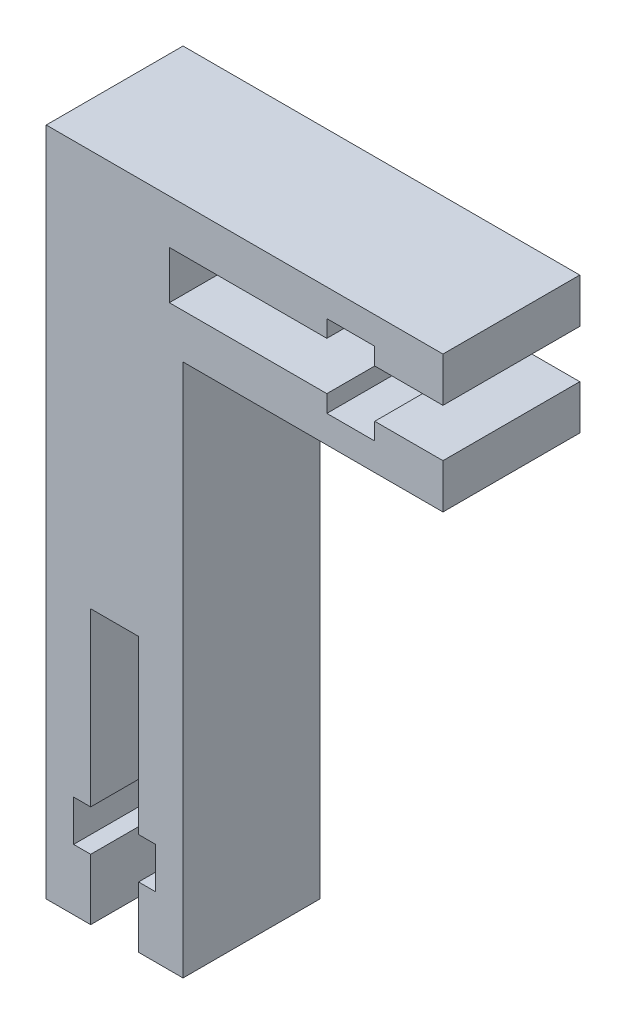
ISO-10303-21;
HEADER;
FILE_DESCRIPTION(('STEP AP214'),'2;1');
FILE_NAME('part.step','',(''),(''),'','','');
FILE_SCHEMA(('AUTOMOTIVE_DESIGN { 1 0 10303 214 1 1 1 1 }'));
ENDSEC;
DATA;
#1=APPLICATION_CONTEXT('core data for automotive mechanical design processes');
#2=APPLICATION_PROTOCOL_DEFINITION('international standard','automotive_design',2000,#1);
#3=PRODUCT_CONTEXT('',#1,'mechanical');
#4=PRODUCT('Part','Part','',(#3));
#5=PRODUCT_RELATED_PRODUCT_CATEGORY('part','',(#4));
#6=PRODUCT_DEFINITION_FORMATION('','',#4);
#7=PRODUCT_DEFINITION_CONTEXT('part definition',#1,'design');
#8=PRODUCT_DEFINITION('design','',#6,#7);
#9=PRODUCT_DEFINITION_SHAPE('','',#8);
#10=(LENGTH_UNIT() NAMED_UNIT(*) SI_UNIT(.MILLI.,.METRE.));
#11=(NAMED_UNIT(*) PLANE_ANGLE_UNIT() SI_UNIT($,.RADIAN.));
#12=(NAMED_UNIT(*) SI_UNIT($,.STERADIAN.) SOLID_ANGLE_UNIT());
#13=UNCERTAINTY_MEASURE_WITH_UNIT(LENGTH_MEASURE(1.E-05),#10,'distance_accuracy_value','');
#14=(GEOMETRIC_REPRESENTATION_CONTEXT(3) GLOBAL_UNCERTAINTY_ASSIGNED_CONTEXT((#13)) GLOBAL_UNIT_ASSIGNED_CONTEXT((#10,
#11,#12)) REPRESENTATION_CONTEXT('',''));
#15=CARTESIAN_POINT('',(0.,0.,0.));
#16=DIRECTION('',(0.,0.,1.));
#17=DIRECTION('',(1.,0.,0.));
#18=AXIS2_PLACEMENT_3D('',#15,#16,#17);
#19=CARTESIAN_POINT('',(0.,49.,10.));
#20=DIRECTION('',(1.,0.,0.));
#21=DIRECTION('',(0.,0.,-1.));
#22=AXIS2_PLACEMENT_3D('',#19,#20,#21);
#23=PLANE('',#22);
#24=DIRECTION('',(0.,-1.,0.));
#25=VECTOR('',#24,1.);
#26=CARTESIAN_POINT('',(0.,49.,0.));
#27=LINE('',#26,#25);
#28=CARTESIAN_POINT('',(0.,49.,0.));
#29=VERTEX_POINT('',#28);
#30=CARTESIAN_POINT('',(0.,0.,0.));
#31=VERTEX_POINT('',#30);
#32=EDGE_CURVE('E261',#29,#31,#27,.T.);
#33=ORIENTED_EDGE('',*,*,#32,.T.);
#34=DIRECTION('',(0.,0.,-1.));
#35=VECTOR('',#34,1.);
#36=CARTESIAN_POINT('',(0.,0.,10.));
#37=LINE('',#36,#35);
#38=CARTESIAN_POINT('',(0.,0.,10.));
#39=VERTEX_POINT('',#38);
#40=EDGE_CURVE('E11',#39,#31,#37,.T.);
#41=ORIENTED_EDGE('',*,*,#40,.F.);
#42=DIRECTION('',(0.,-1.,0.));
#43=VECTOR('',#42,1.);
#44=CARTESIAN_POINT('',(0.,49.,10.));
#45=LINE('',#44,#43);
#46=CARTESIAN_POINT('',(0.,49.,10.));
#47=VERTEX_POINT('',#46);
#48=EDGE_CURVE('E319',#47,#39,#45,.T.);
#49=ORIENTED_EDGE('',*,*,#48,.F.);
#50=DIRECTION('',(0.,0.,-1.));
#51=VECTOR('',#50,1.);
#52=CARTESIAN_POINT('',(0.,49.,10.));
#53=LINE('',#52,#51);
#54=EDGE_CURVE('E257',#47,#29,#53,.T.);
#55=ORIENTED_EDGE('',*,*,#54,.T.);
#56=EDGE_LOOP('',(#33,#41,#49,#55));
#57=FACE_BOUND('',#56,.T.);
#58=ADVANCED_FACE('F33',(#57),#23,.F.);
#59=CARTESIAN_POINT('',(0.,0.,10.));
#60=DIRECTION('',(0.,1.,0.));
#61=DIRECTION('',(0.,0.,1.));
#62=AXIS2_PLACEMENT_3D('',#59,#60,#61);
#63=PLANE('',#62);
#64=DIRECTION('',(1.,0.,0.));
#65=VECTOR('',#64,1.);
#66=CARTESIAN_POINT('',(0.,0.,0.));
#67=LINE('',#66,#65);
#68=CARTESIAN_POINT('',(3.25,0.,0.));
#69=VERTEX_POINT('',#68);
#70=EDGE_CURVE('E264',#31,#69,#67,.T.);
#71=ORIENTED_EDGE('',*,*,#70,.T.);
#72=DIRECTION('',(0.,0.,-1.));
#73=VECTOR('',#72,1.);
#74=CARTESIAN_POINT('',(3.25,0.,10.));
#75=LINE('',#74,#73);
#76=CARTESIAN_POINT('',(3.25,0.,10.));
#77=VERTEX_POINT('',#76);
#78=EDGE_CURVE('E41',#77,#69,#75,.T.);
#79=ORIENTED_EDGE('',*,*,#78,.F.);
#80=DIRECTION('',(1.,0.,0.));
#81=VECTOR('',#80,1.);
#82=CARTESIAN_POINT('',(0.,0.,10.));
#83=LINE('',#82,#81);
#84=EDGE_CURVE('E158',#39,#77,#83,.T.);
#85=ORIENTED_EDGE('',*,*,#84,.F.);
#86=ORIENTED_EDGE('',*,*,#40,.T.);
#87=EDGE_LOOP('',(#71,#79,#85,#86));
#88=FACE_BOUND('',#87,.T.);
#89=ADVANCED_FACE('F487',(#88),#63,.F.);
#90=CARTESIAN_POINT('',(3.25,0.,10.));
#91=DIRECTION('',(-1.,0.,0.));
#92=DIRECTION('',(0.,0.,1.));
#93=AXIS2_PLACEMENT_3D('',#90,#91,#92);
#94=PLANE('',#93);
#95=DIRECTION('',(0.,1.,0.));
#96=VECTOR('',#95,1.);
#97=CARTESIAN_POINT('',(3.25,0.,0.));
#98=LINE('',#97,#96);
#99=CARTESIAN_POINT('',(3.25,4.45640920719067,0.));
#100=VERTEX_POINT('',#99);
#101=EDGE_CURVE('E266',#69,#100,#98,.T.);
#102=ORIENTED_EDGE('',*,*,#101,.T.);
#103=DIRECTION('',(0.,0.,-1.));
#104=VECTOR('',#103,1.);
#105=CARTESIAN_POINT('',(3.25,4.45640920719067,10.));
#106=LINE('',#105,#104);
#107=CARTESIAN_POINT('',(3.25,4.45640920719067,10.));
#108=VERTEX_POINT('',#107);
#109=EDGE_CURVE('E392',#108,#100,#106,.T.);
#110=ORIENTED_EDGE('',*,*,#109,.F.);
#111=DIRECTION('',(0.,1.,0.));
#112=VECTOR('',#111,1.);
#113=CARTESIAN_POINT('',(3.25,0.,10.));
#114=LINE('',#113,#112);
#115=EDGE_CURVE('E400',#77,#108,#114,.T.);
#116=ORIENTED_EDGE('',*,*,#115,.F.);
#117=ORIENTED_EDGE('',*,*,#78,.T.);
#118=EDGE_LOOP('',(#102,#110,#116,#117));
#119=FACE_BOUND('',#118,.T.);
#120=ADVANCED_FACE('F398',(#119),#94,.F.);
#121=CARTESIAN_POINT('',(3.25,4.45640920719067,10.));
#122=DIRECTION('',(0.,-1.,0.));
#123=DIRECTION('',(0.,0.,-1.));
#124=AXIS2_PLACEMENT_3D('',#121,#122,#123);
#125=PLANE('',#124);
#126=DIRECTION('',(-1.,0.,0.));
#127=VECTOR('',#126,1.);
#128=CARTESIAN_POINT('',(3.25,4.45640920719067,0.));
#129=LINE('',#128,#127);
#130=CARTESIAN_POINT('',(2.,4.45640920719067,0.));
#131=VERTEX_POINT('',#130);
#132=EDGE_CURVE('E268',#100,#131,#129,.T.);
#133=ORIENTED_EDGE('',*,*,#132,.T.);
#134=DIRECTION('',(0.,0.,-1.));
#135=VECTOR('',#134,1.);
#136=CARTESIAN_POINT('',(2.,4.45640920719067,10.));
#137=LINE('',#136,#135);
#138=CARTESIAN_POINT('',(2.,4.45640920719067,10.));
#139=VERTEX_POINT('',#138);
#140=EDGE_CURVE('E389',#139,#131,#137,.T.);
#141=ORIENTED_EDGE('',*,*,#140,.F.);
#142=DIRECTION('',(-1.,0.,0.));
#143=VECTOR('',#142,1.);
#144=CARTESIAN_POINT('',(3.25,4.45640920719067,10.));
#145=LINE('',#144,#143);
#146=EDGE_CURVE('E418',#108,#139,#145,.T.);
#147=ORIENTED_EDGE('',*,*,#146,.F.);
#148=ORIENTED_EDGE('',*,*,#109,.T.);
#149=EDGE_LOOP('',(#133,#141,#147,#148));
#150=FACE_BOUND('',#149,.T.);
#151=ADVANCED_FACE('F409',(#150),#125,.F.);
#152=CARTESIAN_POINT('',(2.,4.45640920719067,10.));
#153=DIRECTION('',(-1.,0.,0.));
#154=DIRECTION('',(0.,0.,1.));
#155=AXIS2_PLACEMENT_3D('',#152,#153,#154);
#156=PLANE('',#155);
#157=DIRECTION('',(0.,1.,0.));
#158=VECTOR('',#157,1.);
#159=CARTESIAN_POINT('',(2.,4.45640920719067,0.));
#160=LINE('',#159,#158);
#161=CARTESIAN_POINT('',(2.,7.45640920719067,0.));
#162=VERTEX_POINT('',#161);
#163=EDGE_CURVE('E270',#131,#162,#160,.T.);
#164=ORIENTED_EDGE('',*,*,#163,.T.);
#165=DIRECTION('',(0.,0.,-1.));
#166=VECTOR('',#165,1.);
#167=CARTESIAN_POINT('',(2.,7.45640920719067,10.));
#168=LINE('',#167,#166);
#169=CARTESIAN_POINT('',(2.,7.45640920719067,10.));
#170=VERTEX_POINT('',#169);
#171=EDGE_CURVE('E386',#170,#162,#168,.T.);
#172=ORIENTED_EDGE('',*,*,#171,.F.);
#173=DIRECTION('',(0.,1.,0.));
#174=VECTOR('',#173,1.);
#175=CARTESIAN_POINT('',(2.,4.45640920719067,10.));
#176=LINE('',#175,#174);
#177=EDGE_CURVE('E415',#139,#170,#176,.T.);
#178=ORIENTED_EDGE('',*,*,#177,.F.);
#179=ORIENTED_EDGE('',*,*,#140,.T.);
#180=EDGE_LOOP('',(#164,#172,#178,#179));
#181=FACE_BOUND('',#180,.T.);
#182=ADVANCED_FACE('F413',(#181),#156,.F.);
#183=CARTESIAN_POINT('',(2.,7.45640920719067,10.));
#184=DIRECTION('',(0.,1.,0.));
#185=DIRECTION('',(0.,0.,1.));
#186=AXIS2_PLACEMENT_3D('',#183,#184,#185);
#187=PLANE('',#186);
#188=DIRECTION('',(1.,0.,0.));
#189=VECTOR('',#188,1.);
#190=CARTESIAN_POINT('',(2.,7.45640920719067,0.));
#191=LINE('',#190,#189);
#192=CARTESIAN_POINT('',(3.25,7.45640920719067,0.));
#193=VERTEX_POINT('',#192);
#194=EDGE_CURVE('E272',#162,#193,#191,.T.);
#195=ORIENTED_EDGE('',*,*,#194,.T.);
#196=DIRECTION('',(0.,0.,-1.));
#197=VECTOR('',#196,1.);
#198=CARTESIAN_POINT('',(3.25,7.45640920719067,10.));
#199=LINE('',#198,#197);
#200=CARTESIAN_POINT('',(3.25,7.45640920719067,10.));
#201=VERTEX_POINT('',#200);
#202=EDGE_CURVE('E383',#201,#193,#199,.T.);
#203=ORIENTED_EDGE('',*,*,#202,.F.);
#204=DIRECTION('',(1.,0.,0.));
#205=VECTOR('',#204,1.);
#206=CARTESIAN_POINT('',(2.,7.45640920719067,10.));
#207=LINE('',#206,#205);
#208=EDGE_CURVE('E417',#170,#201,#207,.T.);
#209=ORIENTED_EDGE('',*,*,#208,.F.);
#210=ORIENTED_EDGE('',*,*,#171,.T.);
#211=EDGE_LOOP('',(#195,#203,#209,#210));
#212=FACE_BOUND('',#211,.T.);
#213=ADVANCED_FACE('F500',(#212),#187,.F.);
#214=CARTESIAN_POINT('',(3.25,7.45640920719067,10.));
#215=DIRECTION('',(-1.,0.,0.));
#216=DIRECTION('',(0.,0.,1.));
#217=AXIS2_PLACEMENT_3D('',#214,#215,#216);
#218=PLANE('',#217);
#219=DIRECTION('',(0.,1.,0.));
#220=VECTOR('',#219,1.);
#221=CARTESIAN_POINT('',(3.25,7.45640920719067,0.));
#222=LINE('',#221,#220);
#223=CARTESIAN_POINT('',(3.25,20.,0.));
#224=VERTEX_POINT('',#223);
#225=EDGE_CURVE('E274',#193,#224,#222,.T.);
#226=ORIENTED_EDGE('',*,*,#225,.T.);
#227=DIRECTION('',(0.,0.,-1.));
#228=VECTOR('',#227,1.);
#229=CARTESIAN_POINT('',(3.25,20.,10.));
#230=LINE('',#229,#228);
#231=CARTESIAN_POINT('',(3.25,20.,10.));
#232=VERTEX_POINT('',#231);
#233=EDGE_CURVE('E380',#232,#224,#230,.T.);
#234=ORIENTED_EDGE('',*,*,#233,.F.);
#235=DIRECTION('',(0.,1.,0.));
#236=VECTOR('',#235,1.);
#237=CARTESIAN_POINT('',(3.25,7.45640920719067,10.));
#238=LINE('',#237,#236);
#239=EDGE_CURVE('E420',#201,#232,#238,.T.);
#240=ORIENTED_EDGE('',*,*,#239,.F.);
#241=ORIENTED_EDGE('',*,*,#202,.T.);
#242=EDGE_LOOP('',(#226,#234,#240,#241));
#243=FACE_BOUND('',#242,.T.);
#244=ADVANCED_FACE('F503',(#243),#218,.F.);
#245=CARTESIAN_POINT('',(3.25,20.,10.));
#246=DIRECTION('',(0.,1.,0.));
#247=DIRECTION('',(0.,0.,1.));
#248=AXIS2_PLACEMENT_3D('',#245,#246,#247);
#249=PLANE('',#248);
#250=DIRECTION('',(1.,0.,0.));
#251=VECTOR('',#250,1.);
#252=CARTESIAN_POINT('',(3.25,20.,0.));
#253=LINE('',#252,#251);
#254=CARTESIAN_POINT('',(6.75,20.,0.));
#255=VERTEX_POINT('',#254);
#256=EDGE_CURVE('E276',#224,#255,#253,.T.);
#257=ORIENTED_EDGE('',*,*,#256,.T.);
#258=DIRECTION('',(0.,0.,-1.));
#259=VECTOR('',#258,1.);
#260=CARTESIAN_POINT('',(6.75,20.,10.));
#261=LINE('',#260,#259);
#262=CARTESIAN_POINT('',(6.75,20.,10.));
#263=VERTEX_POINT('',#262);
#264=EDGE_CURVE('E377',#263,#255,#261,.T.);
#265=ORIENTED_EDGE('',*,*,#264,.F.);
#266=DIRECTION('',(1.,0.,0.));
#267=VECTOR('',#266,1.);
#268=CARTESIAN_POINT('',(3.25,20.,10.));
#269=LINE('',#268,#267);
#270=EDGE_CURVE('E426',#232,#263,#269,.T.);
#271=ORIENTED_EDGE('',*,*,#270,.F.);
#272=ORIENTED_EDGE('',*,*,#233,.T.);
#273=EDGE_LOOP('',(#257,#265,#271,#272));
#274=FACE_BOUND('',#273,.T.);
#275=ADVANCED_FACE('F507',(#274),#249,.F.);
#276=CARTESIAN_POINT('',(6.75,20.,10.));
#277=DIRECTION('',(1.,0.,0.));
#278=DIRECTION('',(0.,0.,-1.));
#279=AXIS2_PLACEMENT_3D('',#276,#277,#278);
#280=PLANE('',#279);
#281=DIRECTION('',(0.,-1.,0.));
#282=VECTOR('',#281,1.);
#283=CARTESIAN_POINT('',(6.75,20.,0.));
#284=LINE('',#283,#282);
#285=CARTESIAN_POINT('',(6.75,7.45640920719067,0.));
#286=VERTEX_POINT('',#285);
#287=EDGE_CURVE('E278',#255,#286,#284,.T.);
#288=ORIENTED_EDGE('',*,*,#287,.T.);
#289=DIRECTION('',(0.,0.,-1.));
#290=VECTOR('',#289,1.);
#291=CARTESIAN_POINT('',(6.75,7.45640920719067,10.));
#292=LINE('',#291,#290);
#293=CARTESIAN_POINT('',(6.75,7.45640920719067,10.));
#294=VERTEX_POINT('',#293);
#295=EDGE_CURVE('E374',#294,#286,#292,.T.);
#296=ORIENTED_EDGE('',*,*,#295,.F.);
#297=DIRECTION('',(0.,-1.,0.));
#298=VECTOR('',#297,1.);
#299=CARTESIAN_POINT('',(6.75,20.,10.));
#300=LINE('',#299,#298);
#301=EDGE_CURVE('E428',#263,#294,#300,.T.);
#302=ORIENTED_EDGE('',*,*,#301,.F.);
#303=ORIENTED_EDGE('',*,*,#264,.T.);
#304=EDGE_LOOP('',(#288,#296,#302,#303));
#305=FACE_BOUND('',#304,.T.);
#306=ADVANCED_FACE('F511',(#305),#280,.F.);
#307=CARTESIAN_POINT('',(6.75,7.45640920719067,10.));
#308=DIRECTION('',(0.,1.,0.));
#309=DIRECTION('',(0.,0.,1.));
#310=AXIS2_PLACEMENT_3D('',#307,#308,#309);
#311=PLANE('',#310);
#312=DIRECTION('',(1.,0.,0.));
#313=VECTOR('',#312,1.);
#314=CARTESIAN_POINT('',(6.75,7.45640920719067,0.));
#315=LINE('',#314,#313);
#316=CARTESIAN_POINT('',(8.,7.45640920719067,0.));
#317=VERTEX_POINT('',#316);
#318=EDGE_CURVE('E280',#286,#317,#315,.T.);
#319=ORIENTED_EDGE('',*,*,#318,.T.);
#320=DIRECTION('',(0.,0.,-1.));
#321=VECTOR('',#320,1.);
#322=CARTESIAN_POINT('',(8.,7.45640920719067,10.));
#323=LINE('',#322,#321);
#324=CARTESIAN_POINT('',(8.,7.45640920719067,10.));
#325=VERTEX_POINT('',#324);
#326=EDGE_CURVE('E371',#325,#317,#323,.T.);
#327=ORIENTED_EDGE('',*,*,#326,.F.);
#328=DIRECTION('',(1.,0.,0.));
#329=VECTOR('',#328,1.);
#330=CARTESIAN_POINT('',(6.75,7.45640920719067,10.));
#331=LINE('',#330,#329);
#332=EDGE_CURVE('E430',#294,#325,#331,.T.);
#333=ORIENTED_EDGE('',*,*,#332,.F.);
#334=ORIENTED_EDGE('',*,*,#295,.T.);
#335=EDGE_LOOP('',(#319,#327,#333,#334));
#336=FACE_BOUND('',#335,.T.);
#337=ADVANCED_FACE('F515',(#336),#311,.F.);
#338=CARTESIAN_POINT('',(8.,7.45640920719067,10.));
#339=DIRECTION('',(1.,0.,0.));
#340=DIRECTION('',(0.,0.,-1.));
#341=AXIS2_PLACEMENT_3D('',#338,#339,#340);
#342=PLANE('',#341);
#343=DIRECTION('',(0.,-1.,0.));
#344=VECTOR('',#343,1.);
#345=CARTESIAN_POINT('',(8.,7.45640920719067,0.));
#346=LINE('',#345,#344);
#347=CARTESIAN_POINT('',(8.,4.45640920719067,0.));
#348=VERTEX_POINT('',#347);
#349=EDGE_CURVE('E282',#317,#348,#346,.T.);
#350=ORIENTED_EDGE('',*,*,#349,.T.);
#351=DIRECTION('',(0.,0.,-1.));
#352=VECTOR('',#351,1.);
#353=CARTESIAN_POINT('',(8.,4.45640920719067,10.));
#354=LINE('',#353,#352);
#355=CARTESIAN_POINT('',(8.,4.45640920719067,10.));
#356=VERTEX_POINT('',#355);
#357=EDGE_CURVE('E368',#356,#348,#354,.T.);
#358=ORIENTED_EDGE('',*,*,#357,.F.);
#359=DIRECTION('',(0.,-1.,0.));
#360=VECTOR('',#359,1.);
#361=CARTESIAN_POINT('',(8.,7.45640920719067,10.));
#362=LINE('',#361,#360);
#363=EDGE_CURVE('E432',#325,#356,#362,.T.);
#364=ORIENTED_EDGE('',*,*,#363,.F.);
#365=ORIENTED_EDGE('',*,*,#326,.T.);
#366=EDGE_LOOP('',(#350,#358,#364,#365));
#367=FACE_BOUND('',#366,.T.);
#368=ADVANCED_FACE('F519',(#367),#342,.F.);
#369=CARTESIAN_POINT('',(8.,4.45640920719067,10.));
#370=DIRECTION('',(0.,-1.,0.));
#371=DIRECTION('',(0.,0.,-1.));
#372=AXIS2_PLACEMENT_3D('',#369,#370,#371);
#373=PLANE('',#372);
#374=DIRECTION('',(-1.,0.,0.));
#375=VECTOR('',#374,1.);
#376=CARTESIAN_POINT('',(8.,4.45640920719067,0.));
#377=LINE('',#376,#375);
#378=CARTESIAN_POINT('',(6.75,4.45640920719067,0.));
#379=VERTEX_POINT('',#378);
#380=EDGE_CURVE('E284',#348,#379,#377,.T.);
#381=ORIENTED_EDGE('',*,*,#380,.T.);
#382=DIRECTION('',(0.,0.,-1.));
#383=VECTOR('',#382,1.);
#384=CARTESIAN_POINT('',(6.75,4.45640920719067,10.));
#385=LINE('',#384,#383);
#386=CARTESIAN_POINT('',(6.75,4.45640920719067,10.));
#387=VERTEX_POINT('',#386);
#388=EDGE_CURVE('E365',#387,#379,#385,.T.);
#389=ORIENTED_EDGE('',*,*,#388,.F.);
#390=DIRECTION('',(-1.,0.,0.));
#391=VECTOR('',#390,1.);
#392=CARTESIAN_POINT('',(8.,4.45640920719067,10.));
#393=LINE('',#392,#391);
#394=EDGE_CURVE('E434',#356,#387,#393,.T.);
#395=ORIENTED_EDGE('',*,*,#394,.F.);
#396=ORIENTED_EDGE('',*,*,#357,.T.);
#397=EDGE_LOOP('',(#381,#389,#395,#396));
#398=FACE_BOUND('',#397,.T.);
#399=ADVANCED_FACE('F523',(#398),#373,.F.);
#400=CARTESIAN_POINT('',(6.75,4.45640920719067,10.));
#401=DIRECTION('',(1.,0.,0.));
#402=DIRECTION('',(0.,1.,0.));
#403=AXIS2_PLACEMENT_3D('',#400,#401,#402);
#404=PLANE('',#403);
#405=DIRECTION('',(0.,-1.,0.));
#406=VECTOR('',#405,1.);
#407=CARTESIAN_POINT('',(6.75,4.45640920719067,0.));
#408=LINE('',#407,#406);
#409=CARTESIAN_POINT('',(6.75,0.,0.));
#410=VERTEX_POINT('',#409);
#411=EDGE_CURVE('E286',#379,#410,#408,.T.);
#412=ORIENTED_EDGE('',*,*,#411,.T.);
#413=DIRECTION('',(0.,0.,-1.));
#414=VECTOR('',#413,1.);
#415=CARTESIAN_POINT('',(6.75,0.,10.));
#416=LINE('',#415,#414);
#417=CARTESIAN_POINT('',(6.75,0.,10.));
#418=VERTEX_POINT('',#417);
#419=EDGE_CURVE('E362',#418,#410,#416,.T.);
#420=ORIENTED_EDGE('',*,*,#419,.F.);
#421=DIRECTION('',(0.,-1.,0.));
#422=VECTOR('',#421,1.);
#423=CARTESIAN_POINT('',(6.75,4.45640920719067,10.));
#424=LINE('',#423,#422);
#425=EDGE_CURVE('E436',#387,#418,#424,.T.);
#426=ORIENTED_EDGE('',*,*,#425,.F.);
#427=ORIENTED_EDGE('',*,*,#388,.T.);
#428=EDGE_LOOP('',(#412,#420,#426,#427));
#429=FACE_BOUND('',#428,.T.);
#430=ADVANCED_FACE('F527',(#429),#404,.F.);
#431=CARTESIAN_POINT('',(6.75,0.,10.));
#432=DIRECTION('',(0.,1.,0.));
#433=DIRECTION('',(0.,0.,1.));
#434=AXIS2_PLACEMENT_3D('',#431,#432,#433);
#435=PLANE('',#434);
#436=DIRECTION('',(1.,0.,0.));
#437=VECTOR('',#436,1.);
#438=CARTESIAN_POINT('',(6.75,0.,0.));
#439=LINE('',#438,#437);
#440=CARTESIAN_POINT('',(10.,0.,0.));
#441=VERTEX_POINT('',#440);
#442=EDGE_CURVE('E288',#410,#441,#439,.T.);
#443=ORIENTED_EDGE('',*,*,#442,.T.);
#444=DIRECTION('',(0.,0.,-1.));
#445=VECTOR('',#444,1.);
#446=CARTESIAN_POINT('',(10.,0.,10.));
#447=LINE('',#446,#445);
#448=CARTESIAN_POINT('',(10.,0.,10.));
#449=VERTEX_POINT('',#448);
#450=EDGE_CURVE('E359',#449,#441,#447,.T.);
#451=ORIENTED_EDGE('',*,*,#450,.F.);
#452=DIRECTION('',(1.,0.,0.));
#453=VECTOR('',#452,1.);
#454=CARTESIAN_POINT('',(6.75,0.,10.));
#455=LINE('',#454,#453);
#456=EDGE_CURVE('E438',#418,#449,#455,.T.);
#457=ORIENTED_EDGE('',*,*,#456,.F.);
#458=ORIENTED_EDGE('',*,*,#419,.T.);
#459=EDGE_LOOP('',(#443,#451,#457,#458));
#460=FACE_BOUND('',#459,.T.);
#461=ADVANCED_FACE('F531',(#460),#435,.F.);
#462=CARTESIAN_POINT('',(10.,0.,10.));
#463=DIRECTION('',(-1.,0.,0.));
#464=DIRECTION('',(0.,0.,1.));
#465=AXIS2_PLACEMENT_3D('',#462,#463,#464);
#466=PLANE('',#465);
#467=DIRECTION('',(0.,1.,0.));
#468=VECTOR('',#467,1.);
#469=CARTESIAN_POINT('',(10.,0.,0.));
#470=LINE('',#469,#468);
#471=CARTESIAN_POINT('',(10.,39.,0.));
#472=VERTEX_POINT('',#471);
#473=EDGE_CURVE('E290',#441,#472,#470,.T.);
#474=ORIENTED_EDGE('',*,*,#473,.T.);
#475=DIRECTION('',(0.,0.,-1.));
#476=VECTOR('',#475,1.);
#477=CARTESIAN_POINT('',(10.,39.,10.));
#478=LINE('',#477,#476);
#479=CARTESIAN_POINT('',(10.,39.,10.));
#480=VERTEX_POINT('',#479);
#481=EDGE_CURVE('E356',#480,#472,#478,.T.);
#482=ORIENTED_EDGE('',*,*,#481,.F.);
#483=DIRECTION('',(0.,1.,0.));
#484=VECTOR('',#483,1.);
#485=CARTESIAN_POINT('',(10.,0.,10.));
#486=LINE('',#485,#484);
#487=EDGE_CURVE('E440',#449,#480,#486,.T.);
#488=ORIENTED_EDGE('',*,*,#487,.F.);
#489=ORIENTED_EDGE('',*,*,#450,.T.);
#490=EDGE_LOOP('',(#474,#482,#488,#489));
#491=FACE_BOUND('',#490,.T.);
#492=ADVANCED_FACE('F535',(#491),#466,.F.);
#493=CARTESIAN_POINT('',(10.,39.,10.));
#494=DIRECTION('',(0.,1.,0.));
#495=DIRECTION('',(0.,0.,1.));
#496=AXIS2_PLACEMENT_3D('',#493,#494,#495);
#497=PLANE('',#496);
#498=DIRECTION('',(1.,0.,0.));
#499=VECTOR('',#498,1.);
#500=CARTESIAN_POINT('',(10.,39.,0.));
#501=LINE('',#500,#499);
#502=CARTESIAN_POINT('',(29.,39.,0.));
#503=VERTEX_POINT('',#502);
#504=EDGE_CURVE('E292',#472,#503,#501,.T.);
#505=ORIENTED_EDGE('',*,*,#504,.T.);
#506=DIRECTION('',(0.,0.,-1.));
#507=VECTOR('',#506,1.);
#508=CARTESIAN_POINT('',(29.,39.,10.));
#509=LINE('',#508,#507);
#510=CARTESIAN_POINT('',(29.,39.,10.));
#511=VERTEX_POINT('',#510);
#512=EDGE_CURVE('E353',#511,#503,#509,.T.);
#513=ORIENTED_EDGE('',*,*,#512,.F.);
#514=DIRECTION('',(1.,0.,0.));
#515=VECTOR('',#514,1.);
#516=CARTESIAN_POINT('',(10.,39.,10.));
#517=LINE('',#516,#515);
#518=EDGE_CURVE('E442',#480,#511,#517,.T.);
#519=ORIENTED_EDGE('',*,*,#518,.F.);
#520=ORIENTED_EDGE('',*,*,#481,.T.);
#521=EDGE_LOOP('',(#505,#513,#519,#520));
#522=FACE_BOUND('',#521,.T.);
#523=ADVANCED_FACE('F539',(#522),#497,.F.);
#524=CARTESIAN_POINT('',(29.,39.,10.));
#525=DIRECTION('',(-1.,0.,0.));
#526=DIRECTION('',(0.,0.,1.));
#527=AXIS2_PLACEMENT_3D('',#524,#525,#526);
#528=PLANE('',#527);
#529=DIRECTION('',(0.,1.,0.));
#530=VECTOR('',#529,1.);
#531=CARTESIAN_POINT('',(29.,39.,0.));
#532=LINE('',#531,#530);
#533=CARTESIAN_POINT('',(29.,42.25,0.));
#534=VERTEX_POINT('',#533);
#535=EDGE_CURVE('E294',#503,#534,#532,.T.);
#536=ORIENTED_EDGE('',*,*,#535,.T.);
#537=DIRECTION('',(0.,0.,-1.));
#538=VECTOR('',#537,1.);
#539=CARTESIAN_POINT('',(29.,42.25,10.));
#540=LINE('',#539,#538);
#541=CARTESIAN_POINT('',(29.,42.25,10.));
#542=VERTEX_POINT('',#541);
#543=EDGE_CURVE('E350',#542,#534,#540,.T.);
#544=ORIENTED_EDGE('',*,*,#543,.F.);
#545=DIRECTION('',(0.,1.,0.));
#546=VECTOR('',#545,1.);
#547=CARTESIAN_POINT('',(29.,39.,10.));
#548=LINE('',#547,#546);
#549=EDGE_CURVE('E444',#511,#542,#548,.T.);
#550=ORIENTED_EDGE('',*,*,#549,.F.);
#551=ORIENTED_EDGE('',*,*,#512,.T.);
#552=EDGE_LOOP('',(#536,#544,#550,#551));
#553=FACE_BOUND('',#552,.T.);
#554=ADVANCED_FACE('F543',(#553),#528,.F.);
#555=CARTESIAN_POINT('',(24.0129878709469,42.25,10.));
#556=DIRECTION('',(0.,-1.,0.));
#557=DIRECTION('',(0.,0.,-1.));
#558=AXIS2_PLACEMENT_3D('',#555,#556,#557);
#559=PLANE('',#558);
#560=DIRECTION('',(-1.,0.,0.));
#561=VECTOR('',#560,1.);
#562=CARTESIAN_POINT('',(24.0129878709469,42.25,0.));
#563=LINE('',#562,#561);
#564=CARTESIAN_POINT('',(24.0129878709469,42.25,0.));
#565=VERTEX_POINT('',#564);
#566=EDGE_CURVE('E296',#534,#565,#563,.T.);
#567=ORIENTED_EDGE('',*,*,#566,.T.);
#568=DIRECTION('',(0.,0.,-1.));
#569=VECTOR('',#568,1.);
#570=CARTESIAN_POINT('',(24.0129878709469,42.25,10.));
#571=LINE('',#570,#569);
#572=CARTESIAN_POINT('',(24.0129878709469,42.25,10.));
#573=VERTEX_POINT('',#572);
#574=EDGE_CURVE('E347',#573,#565,#571,.T.);
#575=ORIENTED_EDGE('',*,*,#574,.F.);
#576=DIRECTION('',(-1.,0.,0.));
#577=VECTOR('',#576,1.);
#578=CARTESIAN_POINT('',(24.0129878709469,42.25,10.));
#579=LINE('',#578,#577);
#580=EDGE_CURVE('E446',#542,#573,#579,.T.);
#581=ORIENTED_EDGE('',*,*,#580,.F.);
#582=ORIENTED_EDGE('',*,*,#543,.T.);
#583=EDGE_LOOP('',(#567,#575,#581,#582));
#584=FACE_BOUND('',#583,.T.);
#585=ADVANCED_FACE('F547',(#584),#559,.F.);
#586=CARTESIAN_POINT('',(24.0129878709469,41.,10.));
#587=DIRECTION('',(1.,0.,0.));
#588=DIRECTION('',(0.,0.,-1.));
#589=AXIS2_PLACEMENT_3D('',#586,#587,#588);
#590=PLANE('',#589);
#591=DIRECTION('',(0.,-1.,0.));
#592=VECTOR('',#591,1.);
#593=CARTESIAN_POINT('',(24.0129878709469,41.,0.));
#594=LINE('',#593,#592);
#595=CARTESIAN_POINT('',(24.0129878709469,41.,0.));
#596=VERTEX_POINT('',#595);
#597=EDGE_CURVE('E298',#565,#596,#594,.T.);
#598=ORIENTED_EDGE('',*,*,#597,.T.);
#599=DIRECTION('',(0.,0.,-1.));
#600=VECTOR('',#599,1.);
#601=CARTESIAN_POINT('',(24.0129878709469,41.,10.));
#602=LINE('',#601,#600);
#603=CARTESIAN_POINT('',(24.0129878709469,41.,10.));
#604=VERTEX_POINT('',#603);
#605=EDGE_CURVE('E344',#604,#596,#602,.T.);
#606=ORIENTED_EDGE('',*,*,#605,.F.);
#607=DIRECTION('',(0.,-1.,0.));
#608=VECTOR('',#607,1.);
#609=CARTESIAN_POINT('',(24.0129878709469,41.,10.));
#610=LINE('',#609,#608);
#611=EDGE_CURVE('E448',#573,#604,#610,.T.);
#612=ORIENTED_EDGE('',*,*,#611,.F.);
#613=ORIENTED_EDGE('',*,*,#574,.T.);
#614=EDGE_LOOP('',(#598,#606,#612,#613));
#615=FACE_BOUND('',#614,.T.);
#616=ADVANCED_FACE('F551',(#615),#590,.F.);
#617=CARTESIAN_POINT('',(20.5129878709469,41.,10.));
#618=DIRECTION('',(0.,-1.,0.));
#619=DIRECTION('',(0.,0.,-1.));
#620=AXIS2_PLACEMENT_3D('',#617,#618,#619);
#621=PLANE('',#620);
#622=DIRECTION('',(-1.,0.,0.));
#623=VECTOR('',#622,1.);
#624=CARTESIAN_POINT('',(20.5129878709469,41.,0.));
#625=LINE('',#624,#623);
#626=CARTESIAN_POINT('',(20.5129878709469,41.,0.));
#627=VERTEX_POINT('',#626);
#628=EDGE_CURVE('E300',#596,#627,#625,.T.);
#629=ORIENTED_EDGE('',*,*,#628,.T.);
#630=DIRECTION('',(0.,0.,-1.));
#631=VECTOR('',#630,1.);
#632=CARTESIAN_POINT('',(20.5129878709469,41.,10.));
#633=LINE('',#632,#631);
#634=CARTESIAN_POINT('',(20.5129878709469,41.,10.));
#635=VERTEX_POINT('',#634);
#636=EDGE_CURVE('E341',#635,#627,#633,.T.);
#637=ORIENTED_EDGE('',*,*,#636,.F.);
#638=DIRECTION('',(-1.,0.,0.));
#639=VECTOR('',#638,1.);
#640=CARTESIAN_POINT('',(20.5129878709469,41.,10.));
#641=LINE('',#640,#639);
#642=EDGE_CURVE('E450',#604,#635,#641,.T.);
#643=ORIENTED_EDGE('',*,*,#642,.F.);
#644=ORIENTED_EDGE('',*,*,#605,.T.);
#645=EDGE_LOOP('',(#629,#637,#643,#644));
#646=FACE_BOUND('',#645,.T.);
#647=ADVANCED_FACE('F555',(#646),#621,.F.);
#648=CARTESIAN_POINT('',(20.5129878709469,42.25,10.));
#649=DIRECTION('',(-1.,0.,0.));
#650=DIRECTION('',(0.,0.,1.));
#651=AXIS2_PLACEMENT_3D('',#648,#649,#650);
#652=PLANE('',#651);
#653=DIRECTION('',(0.,1.,0.));
#654=VECTOR('',#653,1.);
#655=CARTESIAN_POINT('',(20.5129878709469,42.25,0.));
#656=LINE('',#655,#654);
#657=CARTESIAN_POINT('',(20.5129878709469,42.25,0.));
#658=VERTEX_POINT('',#657);
#659=EDGE_CURVE('E302',#627,#658,#656,.T.);
#660=ORIENTED_EDGE('',*,*,#659,.T.);
#661=DIRECTION('',(0.,0.,-1.));
#662=VECTOR('',#661,1.);
#663=CARTESIAN_POINT('',(20.5129878709469,42.25,10.));
#664=LINE('',#663,#662);
#665=CARTESIAN_POINT('',(20.5129878709469,42.25,10.));
#666=VERTEX_POINT('',#665);
#667=EDGE_CURVE('E338',#666,#658,#664,.T.);
#668=ORIENTED_EDGE('',*,*,#667,.F.);
#669=DIRECTION('',(0.,1.,0.));
#670=VECTOR('',#669,1.);
#671=CARTESIAN_POINT('',(20.5129878709469,42.25,10.));
#672=LINE('',#671,#670);
#673=EDGE_CURVE('E452',#635,#666,#672,.T.);
#674=ORIENTED_EDGE('',*,*,#673,.F.);
#675=ORIENTED_EDGE('',*,*,#636,.T.);
#676=EDGE_LOOP('',(#660,#668,#674,#675));
#677=FACE_BOUND('',#676,.T.);
#678=ADVANCED_FACE('F559',(#677),#652,.F.);
#679=CARTESIAN_POINT('',(9.,42.25,10.));
#680=DIRECTION('',(0.,-1.,0.));
#681=DIRECTION('',(0.,0.,-1.));
#682=AXIS2_PLACEMENT_3D('',#679,#680,#681);
#683=PLANE('',#682);
#684=DIRECTION('',(-1.,0.,0.));
#685=VECTOR('',#684,1.);
#686=CARTESIAN_POINT('',(9.,42.25,0.));
#687=LINE('',#686,#685);
#688=CARTESIAN_POINT('',(9.,42.25,0.));
#689=VERTEX_POINT('',#688);
#690=EDGE_CURVE('E304',#658,#689,#687,.T.);
#691=ORIENTED_EDGE('',*,*,#690,.T.);
#692=DIRECTION('',(0.,0.,-1.));
#693=VECTOR('',#692,1.);
#694=CARTESIAN_POINT('',(9.,42.25,10.));
#695=LINE('',#694,#693);
#696=CARTESIAN_POINT('',(9.,42.25,10.));
#697=VERTEX_POINT('',#696);
#698=EDGE_CURVE('E335',#697,#689,#695,.T.);
#699=ORIENTED_EDGE('',*,*,#698,.F.);
#700=DIRECTION('',(-1.,0.,0.));
#701=VECTOR('',#700,1.);
#702=CARTESIAN_POINT('',(9.,42.25,10.));
#703=LINE('',#702,#701);
#704=EDGE_CURVE('E454',#666,#697,#703,.T.);
#705=ORIENTED_EDGE('',*,*,#704,.F.);
#706=ORIENTED_EDGE('',*,*,#667,.T.);
#707=EDGE_LOOP('',(#691,#699,#705,#706));
#708=FACE_BOUND('',#707,.T.);
#709=ADVANCED_FACE('F563',(#708),#683,.F.);
#710=CARTESIAN_POINT('',(9.,45.75,10.));
#711=DIRECTION('',(-1.,0.,0.));
#712=DIRECTION('',(0.,0.,1.));
#713=AXIS2_PLACEMENT_3D('',#710,#711,#712);
#714=PLANE('',#713);
#715=DIRECTION('',(0.,1.,0.));
#716=VECTOR('',#715,1.);
#717=CARTESIAN_POINT('',(9.,45.75,0.));
#718=LINE('',#717,#716);
#719=CARTESIAN_POINT('',(9.,45.75,0.));
#720=VERTEX_POINT('',#719);
#721=EDGE_CURVE('E306',#689,#720,#718,.T.);
#722=ORIENTED_EDGE('',*,*,#721,.T.);
#723=DIRECTION('',(0.,0.,-1.));
#724=VECTOR('',#723,1.);
#725=CARTESIAN_POINT('',(9.,45.75,10.));
#726=LINE('',#725,#724);
#727=CARTESIAN_POINT('',(9.,45.75,10.));
#728=VERTEX_POINT('',#727);
#729=EDGE_CURVE('E332',#728,#720,#726,.T.);
#730=ORIENTED_EDGE('',*,*,#729,.F.);
#731=DIRECTION('',(0.,1.,0.));
#732=VECTOR('',#731,1.);
#733=CARTESIAN_POINT('',(9.,45.75,10.));
#734=LINE('',#733,#732);
#735=EDGE_CURVE('E456',#697,#728,#734,.T.);
#736=ORIENTED_EDGE('',*,*,#735,.F.);
#737=ORIENTED_EDGE('',*,*,#698,.T.);
#738=EDGE_LOOP('',(#722,#730,#736,#737));
#739=FACE_BOUND('',#738,.T.);
#740=ADVANCED_FACE('F567',(#739),#714,.F.);
#741=CARTESIAN_POINT('',(20.5129878709469,45.75,10.));
#742=DIRECTION('',(0.,1.,0.));
#743=DIRECTION('',(0.,0.,1.));
#744=AXIS2_PLACEMENT_3D('',#741,#742,#743);
#745=PLANE('',#744);
#746=DIRECTION('',(1.,0.,0.));
#747=VECTOR('',#746,1.);
#748=CARTESIAN_POINT('',(20.5129878709469,45.75,0.));
#749=LINE('',#748,#747);
#750=CARTESIAN_POINT('',(20.5129878709469,45.75,0.));
#751=VERTEX_POINT('',#750);
#752=EDGE_CURVE('E308',#720,#751,#749,.T.);
#753=ORIENTED_EDGE('',*,*,#752,.T.);
#754=DIRECTION('',(0.,0.,-1.));
#755=VECTOR('',#754,1.);
#756=CARTESIAN_POINT('',(20.5129878709469,45.75,10.));
#757=LINE('',#756,#755);
#758=CARTESIAN_POINT('',(20.5129878709469,45.75,10.));
#759=VERTEX_POINT('',#758);
#760=EDGE_CURVE('E329',#759,#751,#757,.T.);
#761=ORIENTED_EDGE('',*,*,#760,.F.);
#762=DIRECTION('',(1.,0.,0.));
#763=VECTOR('',#762,1.);
#764=CARTESIAN_POINT('',(20.5129878709469,45.75,10.));
#765=LINE('',#764,#763);
#766=EDGE_CURVE('E458',#728,#759,#765,.T.);
#767=ORIENTED_EDGE('',*,*,#766,.F.);
#768=ORIENTED_EDGE('',*,*,#729,.T.);
#769=EDGE_LOOP('',(#753,#761,#767,#768));
#770=FACE_BOUND('',#769,.T.);
#771=ADVANCED_FACE('F571',(#770),#745,.F.);
#772=CARTESIAN_POINT('',(20.5129878709469,47.,10.));
#773=DIRECTION('',(-1.,0.,0.));
#774=DIRECTION('',(0.,0.,1.));
#775=AXIS2_PLACEMENT_3D('',#772,#773,#774);
#776=PLANE('',#775);
#777=DIRECTION('',(0.,1.,0.));
#778=VECTOR('',#777,1.);
#779=CARTESIAN_POINT('',(20.5129878709469,47.,0.));
#780=LINE('',#779,#778);
#781=CARTESIAN_POINT('',(20.5129878709469,47.,0.));
#782=VERTEX_POINT('',#781);
#783=EDGE_CURVE('E310',#751,#782,#780,.T.);
#784=ORIENTED_EDGE('',*,*,#783,.T.);
#785=DIRECTION('',(0.,0.,-1.));
#786=VECTOR('',#785,1.);
#787=CARTESIAN_POINT('',(20.5129878709469,47.,10.));
#788=LINE('',#787,#786);
#789=CARTESIAN_POINT('',(20.5129878709469,47.,10.));
#790=VERTEX_POINT('',#789);
#791=EDGE_CURVE('E326',#790,#782,#788,.T.);
#792=ORIENTED_EDGE('',*,*,#791,.F.);
#793=DIRECTION('',(0.,1.,0.));
#794=VECTOR('',#793,1.);
#795=CARTESIAN_POINT('',(20.5129878709469,47.,10.));
#796=LINE('',#795,#794);
#797=EDGE_CURVE('E460',#759,#790,#796,.T.);
#798=ORIENTED_EDGE('',*,*,#797,.F.);
#799=ORIENTED_EDGE('',*,*,#760,.T.);
#800=EDGE_LOOP('',(#784,#792,#798,#799));
#801=FACE_BOUND('',#800,.T.);
#802=ADVANCED_FACE('F575',(#801),#776,.F.);
#803=CARTESIAN_POINT('',(24.0129878709469,47.,10.));
#804=DIRECTION('',(0.,1.,0.));
#805=DIRECTION('',(0.,0.,1.));
#806=AXIS2_PLACEMENT_3D('',#803,#804,#805);
#807=PLANE('',#806);
#808=DIRECTION('',(1.,0.,0.));
#809=VECTOR('',#808,1.);
#810=CARTESIAN_POINT('',(24.0129878709469,47.,0.));
#811=LINE('',#810,#809);
#812=CARTESIAN_POINT('',(24.0129878709469,47.,0.));
#813=VERTEX_POINT('',#812);
#814=EDGE_CURVE('E312',#782,#813,#811,.T.);
#815=ORIENTED_EDGE('',*,*,#814,.T.);
#816=DIRECTION('',(0.,0.,-1.));
#817=VECTOR('',#816,1.);
#818=CARTESIAN_POINT('',(24.0129878709469,47.,10.));
#819=LINE('',#818,#817);
#820=CARTESIAN_POINT('',(24.0129878709469,47.,10.));
#821=VERTEX_POINT('',#820);
#822=EDGE_CURVE('E323',#821,#813,#819,.T.);
#823=ORIENTED_EDGE('',*,*,#822,.F.);
#824=DIRECTION('',(1.,0.,0.));
#825=VECTOR('',#824,1.);
#826=CARTESIAN_POINT('',(24.0129878709469,47.,10.));
#827=LINE('',#826,#825);
#828=EDGE_CURVE('E462',#790,#821,#827,.T.);
#829=ORIENTED_EDGE('',*,*,#828,.F.);
#830=ORIENTED_EDGE('',*,*,#791,.T.);
#831=EDGE_LOOP('',(#815,#823,#829,#830));
#832=FACE_BOUND('',#831,.T.);
#833=ADVANCED_FACE('F468',(#832),#807,.F.);
#834=CARTESIAN_POINT('',(24.0129878709469,45.75,10.));
#835=DIRECTION('',(1.,0.,0.));
#836=DIRECTION('',(0.,0.,-1.));
#837=AXIS2_PLACEMENT_3D('',#834,#835,#836);
#838=PLANE('',#837);
#839=DIRECTION('',(0.,-1.,0.));
#840=VECTOR('',#839,1.);
#841=CARTESIAN_POINT('',(24.0129878709469,45.75,0.));
#842=LINE('',#841,#840);
#843=CARTESIAN_POINT('',(24.0129878709469,45.75,0.));
#844=VERTEX_POINT('',#843);
#845=EDGE_CURVE('E314',#813,#844,#842,.T.);
#846=ORIENTED_EDGE('',*,*,#845,.T.);
#847=DIRECTION('',(0.,0.,-1.));
#848=VECTOR('',#847,1.);
#849=CARTESIAN_POINT('',(24.0129878709469,45.75,10.));
#850=LINE('',#849,#848);
#851=CARTESIAN_POINT('',(24.0129878709469,45.75,10.));
#852=VERTEX_POINT('',#851);
#853=EDGE_CURVE('E252',#852,#844,#850,.T.);
#854=ORIENTED_EDGE('',*,*,#853,.F.);
#855=DIRECTION('',(0.,-1.,0.));
#856=VECTOR('',#855,1.);
#857=CARTESIAN_POINT('',(24.0129878709469,45.75,10.));
#858=LINE('',#857,#856);
#859=EDGE_CURVE('E243',#821,#852,#858,.T.);
#860=ORIENTED_EDGE('',*,*,#859,.F.);
#861=ORIENTED_EDGE('',*,*,#822,.T.);
#862=EDGE_LOOP('',(#846,#854,#860,#861));
#863=FACE_BOUND('',#862,.T.);
#864=ADVANCED_FACE('F472',(#863),#838,.F.);
#865=CARTESIAN_POINT('',(29.,45.75,10.));
#866=DIRECTION('',(0.,1.,0.));
#867=DIRECTION('',(0.,0.,1.));
#868=AXIS2_PLACEMENT_3D('',#865,#866,#867);
#869=PLANE('',#868);
#870=DIRECTION('',(1.,0.,0.));
#871=VECTOR('',#870,1.);
#872=CARTESIAN_POINT('',(29.,45.75,0.));
#873=LINE('',#872,#871);
#874=CARTESIAN_POINT('',(29.,45.75,0.));
#875=VERTEX_POINT('',#874);
#876=EDGE_CURVE('E251',#844,#875,#873,.T.);
#877=ORIENTED_EDGE('',*,*,#876,.T.);
#878=DIRECTION('',(0.,0.,-1.));
#879=VECTOR('',#878,1.);
#880=CARTESIAN_POINT('',(29.,45.75,10.));
#881=LINE('',#880,#879);
#882=CARTESIAN_POINT('',(29.,45.75,10.));
#883=VERTEX_POINT('',#882);
#884=EDGE_CURVE('E248',#883,#875,#881,.T.);
#885=ORIENTED_EDGE('',*,*,#884,.F.);
#886=DIRECTION('',(1.,0.,0.));
#887=VECTOR('',#886,1.);
#888=CARTESIAN_POINT('',(29.,45.75,10.));
#889=LINE('',#888,#887);
#890=EDGE_CURVE('E237',#852,#883,#889,.T.);
#891=ORIENTED_EDGE('',*,*,#890,.F.);
#892=ORIENTED_EDGE('',*,*,#853,.T.);
#893=EDGE_LOOP('',(#877,#885,#891,#892));
#894=FACE_BOUND('',#893,.T.);
#895=ADVANCED_FACE('F249',(#894),#869,.F.);
#896=CARTESIAN_POINT('',(29.,45.75,10.));
#897=DIRECTION('',(-1.,0.,0.));
#898=DIRECTION('',(0.,0.,1.));
#899=AXIS2_PLACEMENT_3D('',#896,#897,#898);
#900=PLANE('',#899);
#901=DIRECTION('',(0.,1.,0.));
#902=VECTOR('',#901,1.);
#903=CARTESIAN_POINT('',(29.,45.75,0.));
#904=LINE('',#903,#902);
#905=CARTESIAN_POINT('',(29.,49.,0.));
#906=VERTEX_POINT('',#905);
#907=EDGE_CURVE('E144',#875,#906,#904,.T.);
#908=ORIENTED_EDGE('',*,*,#907,.T.);
#909=DIRECTION('',(0.,0.,-1.));
#910=VECTOR('',#909,1.);
#911=CARTESIAN_POINT('',(29.,49.,10.));
#912=LINE('',#911,#910);
#913=CARTESIAN_POINT('',(29.,49.,10.));
#914=VERTEX_POINT('',#913);
#915=EDGE_CURVE('E253',#914,#906,#912,.T.);
#916=ORIENTED_EDGE('',*,*,#915,.F.);
#917=DIRECTION('',(0.,1.,0.));
#918=VECTOR('',#917,1.);
#919=CARTESIAN_POINT('',(29.,45.75,10.));
#920=LINE('',#919,#918);
#921=EDGE_CURVE('E241',#883,#914,#920,.T.);
#922=ORIENTED_EDGE('',*,*,#921,.F.);
#923=ORIENTED_EDGE('',*,*,#884,.T.);
#924=EDGE_LOOP('',(#908,#916,#922,#923));
#925=FACE_BOUND('',#924,.T.);
#926=ADVANCED_FACE('F255',(#925),#900,.F.);
#927=CARTESIAN_POINT('',(29.,49.,10.));
#928=DIRECTION('',(0.,-1.,0.));
#929=DIRECTION('',(1.,0.,0.));
#930=AXIS2_PLACEMENT_3D('',#927,#928,#929);
#931=PLANE('',#930);
#932=DIRECTION('',(-1.,0.,0.));
#933=VECTOR('',#932,1.);
#934=CARTESIAN_POINT('',(29.,49.,0.));
#935=LINE('',#934,#933);
#936=EDGE_CURVE('E150',#906,#29,#935,.T.);
#937=ORIENTED_EDGE('',*,*,#936,.T.);
#938=ORIENTED_EDGE('',*,*,#54,.F.);
#939=DIRECTION('',(-1.,0.,0.));
#940=VECTOR('',#939,1.);
#941=CARTESIAN_POINT('',(29.,49.,10.));
#942=LINE('',#941,#940);
#943=EDGE_CURVE('E49',#914,#47,#942,.T.);
#944=ORIENTED_EDGE('',*,*,#943,.F.);
#945=ORIENTED_EDGE('',*,*,#915,.T.);
#946=EDGE_LOOP('',(#937,#938,#944,#945));
#947=FACE_BOUND('',#946,.T.);
#948=ADVANCED_FACE('F476',(#947),#931,.F.);
#949=CARTESIAN_POINT('',(0.,0.,10.));
#950=DIRECTION('',(0.,0.,1.));
#951=DIRECTION('',(1.,0.,0.));
#952=AXIS2_PLACEMENT_3D('',#949,#950,#951);
#953=PLANE('',#952);
#954=ORIENTED_EDGE('',*,*,#48,.T.);
#955=ORIENTED_EDGE('',*,*,#84,.T.);
#956=ORIENTED_EDGE('',*,*,#115,.T.);
#957=ORIENTED_EDGE('',*,*,#146,.T.);
#958=ORIENTED_EDGE('',*,*,#177,.T.);
#959=ORIENTED_EDGE('',*,*,#208,.T.);
#960=ORIENTED_EDGE('',*,*,#239,.T.);
#961=ORIENTED_EDGE('',*,*,#270,.T.);
#962=ORIENTED_EDGE('',*,*,#301,.T.);
#963=ORIENTED_EDGE('',*,*,#332,.T.);
#964=ORIENTED_EDGE('',*,*,#363,.T.);
#965=ORIENTED_EDGE('',*,*,#394,.T.);
#966=ORIENTED_EDGE('',*,*,#425,.T.);
#967=ORIENTED_EDGE('',*,*,#456,.T.);
#968=ORIENTED_EDGE('',*,*,#487,.T.);
#969=ORIENTED_EDGE('',*,*,#518,.T.);
#970=ORIENTED_EDGE('',*,*,#549,.T.);
#971=ORIENTED_EDGE('',*,*,#580,.T.);
#972=ORIENTED_EDGE('',*,*,#611,.T.);
#973=ORIENTED_EDGE('',*,*,#642,.T.);
#974=ORIENTED_EDGE('',*,*,#673,.T.);
#975=ORIENTED_EDGE('',*,*,#704,.T.);
#976=ORIENTED_EDGE('',*,*,#735,.T.);
#977=ORIENTED_EDGE('',*,*,#766,.T.);
#978=ORIENTED_EDGE('',*,*,#797,.T.);
#979=ORIENTED_EDGE('',*,*,#828,.T.);
#980=ORIENTED_EDGE('',*,*,#859,.T.);
#981=ORIENTED_EDGE('',*,*,#890,.T.);
#982=ORIENTED_EDGE('',*,*,#921,.T.);
#983=ORIENTED_EDGE('',*,*,#943,.T.);
#984=EDGE_LOOP('',(#954,#955,#956,#957,#958,#959,#960,#961,#962,#963,#964,#965,#966,#967,#968,
#969,#970,#971,#972,#973,#974,#975,#976,#977,#978,#979,#980,#981,#982,#983));
#985=FACE_BOUND('',#984,.T.);
#986=ADVANCED_FACE('F239',(#985),#953,.T.);
#987=CARTESIAN_POINT('',(0.,0.,0.));
#988=DIRECTION('',(0.,0.,1.));
#989=DIRECTION('',(1.,0.,0.));
#990=AXIS2_PLACEMENT_3D('',#987,#988,#989);
#991=PLANE('',#990);
#992=ORIENTED_EDGE('',*,*,#32,.F.);
#993=ORIENTED_EDGE('',*,*,#936,.F.);
#994=ORIENTED_EDGE('',*,*,#907,.F.);
#995=ORIENTED_EDGE('',*,*,#876,.F.);
#996=ORIENTED_EDGE('',*,*,#845,.F.);
#997=ORIENTED_EDGE('',*,*,#814,.F.);
#998=ORIENTED_EDGE('',*,*,#783,.F.);
#999=ORIENTED_EDGE('',*,*,#752,.F.);
#1000=ORIENTED_EDGE('',*,*,#721,.F.);
#1001=ORIENTED_EDGE('',*,*,#690,.F.);
#1002=ORIENTED_EDGE('',*,*,#659,.F.);
#1003=ORIENTED_EDGE('',*,*,#628,.F.);
#1004=ORIENTED_EDGE('',*,*,#597,.F.);
#1005=ORIENTED_EDGE('',*,*,#566,.F.);
#1006=ORIENTED_EDGE('',*,*,#535,.F.);
#1007=ORIENTED_EDGE('',*,*,#504,.F.);
#1008=ORIENTED_EDGE('',*,*,#473,.F.);
#1009=ORIENTED_EDGE('',*,*,#442,.F.);
#1010=ORIENTED_EDGE('',*,*,#411,.F.);
#1011=ORIENTED_EDGE('',*,*,#380,.F.);
#1012=ORIENTED_EDGE('',*,*,#349,.F.);
#1013=ORIENTED_EDGE('',*,*,#318,.F.);
#1014=ORIENTED_EDGE('',*,*,#287,.F.);
#1015=ORIENTED_EDGE('',*,*,#256,.F.);
#1016=ORIENTED_EDGE('',*,*,#225,.F.);
#1017=ORIENTED_EDGE('',*,*,#194,.F.);
#1018=ORIENTED_EDGE('',*,*,#163,.F.);
#1019=ORIENTED_EDGE('',*,*,#132,.F.);
#1020=ORIENTED_EDGE('',*,*,#101,.F.);
#1021=ORIENTED_EDGE('',*,*,#70,.F.);
#1022=EDGE_LOOP('',(#992,#993,#994,#995,#996,#997,#998,#999,#1000,#1001,#1002,#1003,#1004,#1005,
#1006,#1007,#1008,#1009,#1010,#1011,#1012,#1013,#1014,#1015,#1016,#1017,#1018,#1019,#1020,#1021));
#1023=FACE_BOUND('',#1022,.T.);
#1024=ADVANCED_FACE('F404',(#1023),#991,.F.);
#1025=CLOSED_SHELL('',(#58,#89,#120,#151,#182,#213,#244,#275,#306,#337,#368,#399,#430,#461,#492,
#523,#554,#585,#616,#647,#678,#709,#740,#771,#802,#833,#864,#895,#926,#948,#986,#1024));
#1026=MANIFOLD_SOLID_BREP('B2',#1025);
#1027=ADVANCED_BREP_SHAPE_REPRESENTATION('',(#18,#1026),#14);
#1028=SHAPE_DEFINITION_REPRESENTATION(#9,#1027);
ENDSEC;
END-ISO-10303-21;
